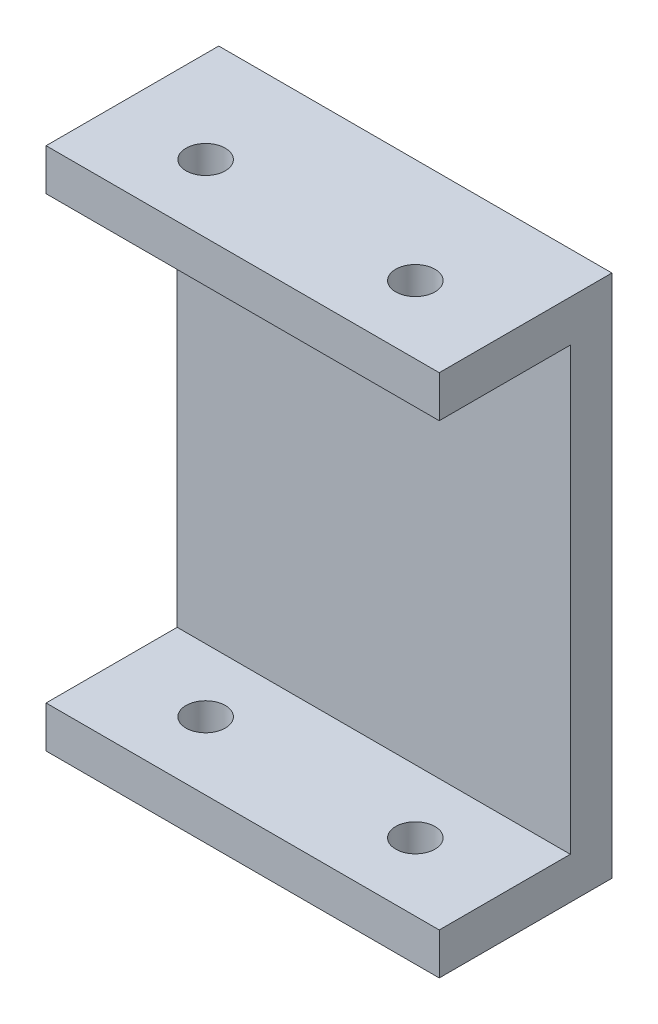
ISO-10303-21;
HEADER;
FILE_DESCRIPTION(('STEP AP214'),'2;1');
FILE_NAME('part.step','',(''),(''),'','','');
FILE_SCHEMA(('AUTOMOTIVE_DESIGN { 1 0 10303 214 1 1 1 1 }'));
ENDSEC;
DATA;
#1=APPLICATION_CONTEXT('core data for automotive mechanical design processes');
#2=APPLICATION_PROTOCOL_DEFINITION('international standard','automotive_design',2000,#1);
#3=PRODUCT_CONTEXT('',#1,'mechanical');
#4=PRODUCT('Part','Part','',(#3));
#5=PRODUCT_RELATED_PRODUCT_CATEGORY('part','',(#4));
#6=PRODUCT_DEFINITION_FORMATION('','',#4);
#7=PRODUCT_DEFINITION_CONTEXT('part definition',#1,'design');
#8=PRODUCT_DEFINITION('design','',#6,#7);
#9=PRODUCT_DEFINITION_SHAPE('','',#8);
#10=(LENGTH_UNIT() NAMED_UNIT(*) SI_UNIT(.MILLI.,.METRE.));
#11=(NAMED_UNIT(*) PLANE_ANGLE_UNIT() SI_UNIT($,.RADIAN.));
#12=(NAMED_UNIT(*) SI_UNIT($,.STERADIAN.) SOLID_ANGLE_UNIT());
#13=UNCERTAINTY_MEASURE_WITH_UNIT(LENGTH_MEASURE(1.E-05),#10,'distance_accuracy_value','');
#14=(GEOMETRIC_REPRESENTATION_CONTEXT(3) GLOBAL_UNCERTAINTY_ASSIGNED_CONTEXT((#13)) GLOBAL_UNIT_ASSIGNED_CONTEXT((#10,
#11,#12)) REPRESENTATION_CONTEXT('',''));
#15=CARTESIAN_POINT('',(0.,0.,0.));
#16=DIRECTION('',(0.,0.,1.));
#17=DIRECTION('',(1.,0.,0.));
#18=AXIS2_PLACEMENT_3D('',#15,#16,#17);
#19=CARTESIAN_POINT('',(0.,0.,3.175));
#20=DIRECTION('',(0.,0.,-1.));
#21=DIRECTION('',(-1.,0.,0.));
#22=AXIS2_PLACEMENT_3D('',#19,#20,#21);
#23=PLANE('',#22);
#24=DIRECTION('',(-1.,0.,0.));
#25=VECTOR('',#24,1.);
#26=CARTESIAN_POINT('',(15.,-16.825,3.175));
#27=LINE('',#26,#25);
#28=CARTESIAN_POINT('',(15.,-16.825,3.175));
#29=VERTEX_POINT('',#28);
#30=CARTESIAN_POINT('',(-15.,-16.825,3.175));
#31=VERTEX_POINT('',#30);
#32=EDGE_CURVE('E50',#29,#31,#27,.T.);
#33=ORIENTED_EDGE('',*,*,#32,.F.);
#34=DIRECTION('',(0.,1.,0.));
#35=VECTOR('',#34,1.);
#36=CARTESIAN_POINT('',(15.,-20.,3.175));
#37=LINE('',#36,#35);
#38=CARTESIAN_POINT('',(15.,16.825,3.175));
#39=VERTEX_POINT('',#38);
#40=EDGE_CURVE('E121',#29,#39,#37,.T.);
#41=ORIENTED_EDGE('',*,*,#40,.T.);
#42=DIRECTION('',(1.,0.,0.));
#43=VECTOR('',#42,1.);
#44=CARTESIAN_POINT('',(-15.,16.825,3.175));
#45=LINE('',#44,#43);
#46=CARTESIAN_POINT('',(-15.,16.825,3.175));
#47=VERTEX_POINT('',#46);
#48=EDGE_CURVE('E122',#47,#39,#45,.T.);
#49=ORIENTED_EDGE('',*,*,#48,.F.);
#50=DIRECTION('',(0.,-1.,0.));
#51=VECTOR('',#50,1.);
#52=CARTESIAN_POINT('',(-15.,-20.,3.175));
#53=LINE('',#52,#51);
#54=EDGE_CURVE('E55',#47,#31,#53,.T.);
#55=ORIENTED_EDGE('',*,*,#54,.T.);
#56=EDGE_LOOP('',(#33,#41,#49,#55));
#57=FACE_BOUND('',#56,.T.);
#58=ADVANCED_FACE('F33',(#57),#23,.F.);
#59=CARTESIAN_POINT('',(15.,-20.,3.175));
#60=DIRECTION('',(-1.,0.,0.));
#61=DIRECTION('',(0.,0.,1.));
#62=AXIS2_PLACEMENT_3D('',#59,#60,#61);
#63=PLANE('',#62);
#64=DIRECTION('',(0.,1.,0.));
#65=VECTOR('',#64,1.);
#66=CARTESIAN_POINT('',(15.,-20.,0.));
#67=LINE('',#66,#65);
#68=CARTESIAN_POINT('',(15.,-20.,0.));
#69=VERTEX_POINT('',#68);
#70=CARTESIAN_POINT('',(15.,20.,0.));
#71=VERTEX_POINT('',#70);
#72=EDGE_CURVE('E145',#69,#71,#67,.T.);
#73=ORIENTED_EDGE('',*,*,#72,.T.);
#74=DIRECTION('',(0.,0.,-1.));
#75=VECTOR('',#74,1.);
#76=CARTESIAN_POINT('',(15.,20.,3.175));
#77=LINE('',#76,#75);
#78=CARTESIAN_POINT('',(15.,20.,13.175));
#79=VERTEX_POINT('',#78);
#80=EDGE_CURVE('E11',#79,#71,#77,.T.);
#81=ORIENTED_EDGE('',*,*,#80,.F.);
#82=DIRECTION('',(0.,1.,0.));
#83=VECTOR('',#82,1.);
#84=CARTESIAN_POINT('',(15.,20.,13.175));
#85=LINE('',#84,#83);
#86=CARTESIAN_POINT('',(15.,16.825,13.175));
#87=VERTEX_POINT('',#86);
#88=EDGE_CURVE('E134',#87,#79,#85,.T.);
#89=ORIENTED_EDGE('',*,*,#88,.F.);
#90=DIRECTION('',(0.,0.,-1.));
#91=VECTOR('',#90,1.);
#92=CARTESIAN_POINT('',(15.,16.825,13.175));
#93=LINE('',#92,#91);
#94=EDGE_CURVE('E139',#87,#39,#93,.T.);
#95=ORIENTED_EDGE('',*,*,#94,.T.);
#96=ORIENTED_EDGE('',*,*,#40,.F.);
#97=DIRECTION('',(0.,0.,-1.));
#98=VECTOR('',#97,1.);
#99=CARTESIAN_POINT('',(15.,-16.825,13.175));
#100=LINE('',#99,#98);
#101=CARTESIAN_POINT('',(15.,-16.825,13.175));
#102=VERTEX_POINT('',#101);
#103=EDGE_CURVE('E102',#102,#29,#100,.T.);
#104=ORIENTED_EDGE('',*,*,#103,.F.);
#105=DIRECTION('',(0.,1.,0.));
#106=VECTOR('',#105,1.);
#107=CARTESIAN_POINT('',(15.,-20.,13.175));
#108=LINE('',#107,#106);
#109=CARTESIAN_POINT('',(15.,-20.,13.175));
#110=VERTEX_POINT('',#109);
#111=EDGE_CURVE('E109',#110,#102,#108,.T.);
#112=ORIENTED_EDGE('',*,*,#111,.F.);
#113=DIRECTION('',(0.,0.,-1.));
#114=VECTOR('',#113,1.);
#115=CARTESIAN_POINT('',(15.,-20.,3.175));
#116=LINE('',#115,#114);
#117=EDGE_CURVE('E149',#110,#69,#116,.T.);
#118=ORIENTED_EDGE('',*,*,#117,.T.);
#119=EDGE_LOOP('',(#73,#81,#89,#95,#96,#104,#112,#118));
#120=FACE_BOUND('',#119,.T.);
#121=ADVANCED_FACE('F35',(#120),#63,.F.);
#122=CARTESIAN_POINT('',(-15.,20.,3.175));
#123=DIRECTION('',(0.,-1.,0.));
#124=DIRECTION('',(0.,0.,-1.));
#125=AXIS2_PLACEMENT_3D('',#122,#123,#124);
#126=PLANE('',#125);
#127=CARTESIAN_POINT('',(-8.,20.,8.));
#128=DIRECTION('',(0.,-1.,0.));
#129=DIRECTION('',(0.,0.,-1.));
#130=AXIS2_PLACEMENT_3D('',#127,#128,#129);
#131=CIRCLE('',#130,1.5);
#132=CARTESIAN_POINT('',(-8.,20.,6.5));
#133=VERTEX_POINT('',#132);
#134=EDGE_CURVE('E183',#133,#133,#131,.T.);
#135=ORIENTED_EDGE('',*,*,#134,.T.);
#136=EDGE_LOOP('',(#135));
#137=FACE_BOUND('',#136,.T.);
#138=CARTESIAN_POINT('',(8.,20.,8.));
#139=DIRECTION('',(0.,-1.,0.));
#140=DIRECTION('',(0.,0.,-1.));
#141=AXIS2_PLACEMENT_3D('',#138,#139,#140);
#142=CIRCLE('',#141,1.5);
#143=CARTESIAN_POINT('',(8.,20.,6.5));
#144=VERTEX_POINT('',#143);
#145=EDGE_CURVE('E168',#144,#144,#142,.T.);
#146=ORIENTED_EDGE('',*,*,#145,.T.);
#147=EDGE_LOOP('',(#146));
#148=FACE_BOUND('',#147,.T.);
#149=DIRECTION('',(-1.,0.,0.));
#150=VECTOR('',#149,1.);
#151=CARTESIAN_POINT('',(-15.,20.,0.));
#152=LINE('',#151,#150);
#153=CARTESIAN_POINT('',(-15.,20.,0.));
#154=VERTEX_POINT('',#153);
#155=EDGE_CURVE('E151',#71,#154,#152,.T.);
#156=ORIENTED_EDGE('',*,*,#155,.T.);
#157=DIRECTION('',(0.,0.,-1.));
#158=VECTOR('',#157,1.);
#159=CARTESIAN_POINT('',(-15.,20.,3.175));
#160=LINE('',#159,#158);
#161=CARTESIAN_POINT('',(-15.,20.,13.175));
#162=VERTEX_POINT('',#161);
#163=EDGE_CURVE('E42',#162,#154,#160,.T.);
#164=ORIENTED_EDGE('',*,*,#163,.F.);
#165=DIRECTION('',(-1.,0.,0.));
#166=VECTOR('',#165,1.);
#167=CARTESIAN_POINT('',(-15.,20.,13.175));
#168=LINE('',#167,#166);
#169=EDGE_CURVE('E137',#79,#162,#168,.T.);
#170=ORIENTED_EDGE('',*,*,#169,.F.);
#171=ORIENTED_EDGE('',*,*,#80,.T.);
#172=EDGE_LOOP('',(#156,#164,#170,#171));
#173=FACE_BOUND('',#172,.T.);
#174=ADVANCED_FACE('F199',(#137,#148,#173),#126,.F.);
#175=CARTESIAN_POINT('',(-15.,-20.,3.175));
#176=DIRECTION('',(1.,0.,0.));
#177=DIRECTION('',(0.,0.,-1.));
#178=AXIS2_PLACEMENT_3D('',#175,#176,#177);
#179=PLANE('',#178);
#180=DIRECTION('',(0.,-1.,0.));
#181=VECTOR('',#180,1.);
#182=CARTESIAN_POINT('',(-15.,-20.,0.));
#183=LINE('',#182,#181);
#184=CARTESIAN_POINT('',(-15.,-20.,0.));
#185=VERTEX_POINT('',#184);
#186=EDGE_CURVE('E153',#154,#185,#183,.T.);
#187=ORIENTED_EDGE('',*,*,#186,.T.);
#188=DIRECTION('',(0.,0.,-1.));
#189=VECTOR('',#188,1.);
#190=CARTESIAN_POINT('',(-15.,-20.,3.175));
#191=LINE('',#190,#189);
#192=CARTESIAN_POINT('',(-15.,-20.,13.175));
#193=VERTEX_POINT('',#192);
#194=EDGE_CURVE('E157',#193,#185,#191,.T.);
#195=ORIENTED_EDGE('',*,*,#194,.F.);
#196=DIRECTION('',(0.,-1.,0.));
#197=VECTOR('',#196,1.);
#198=CARTESIAN_POINT('',(-15.,-20.,13.175));
#199=LINE('',#198,#197);
#200=CARTESIAN_POINT('',(-15.,-16.825,13.175));
#201=VERTEX_POINT('',#200);
#202=EDGE_CURVE('E108',#201,#193,#199,.T.);
#203=ORIENTED_EDGE('',*,*,#202,.F.);
#204=DIRECTION('',(0.,0.,-1.));
#205=VECTOR('',#204,1.);
#206=CARTESIAN_POINT('',(-15.,-16.825,13.175));
#207=LINE('',#206,#205);
#208=EDGE_CURVE('E104',#201,#31,#207,.T.);
#209=ORIENTED_EDGE('',*,*,#208,.T.);
#210=ORIENTED_EDGE('',*,*,#54,.F.);
#211=DIRECTION('',(0.,0.,-1.));
#212=VECTOR('',#211,1.);
#213=CARTESIAN_POINT('',(-15.,16.825,13.175));
#214=LINE('',#213,#212);
#215=CARTESIAN_POINT('',(-15.,16.825,13.175));
#216=VERTEX_POINT('',#215);
#217=EDGE_CURVE('E142',#216,#47,#214,.T.);
#218=ORIENTED_EDGE('',*,*,#217,.F.);
#219=DIRECTION('',(0.,-1.,0.));
#220=VECTOR('',#219,1.);
#221=CARTESIAN_POINT('',(-15.,20.,13.175));
#222=LINE('',#221,#220);
#223=EDGE_CURVE('E125',#162,#216,#222,.T.);
#224=ORIENTED_EDGE('',*,*,#223,.F.);
#225=ORIENTED_EDGE('',*,*,#163,.T.);
#226=EDGE_LOOP('',(#187,#195,#203,#209,#210,#218,#224,#225));
#227=FACE_BOUND('',#226,.T.);
#228=ADVANCED_FACE('F188',(#227),#179,.F.);
#229=CARTESIAN_POINT('',(-15.,-20.,3.175));
#230=DIRECTION('',(0.,1.,0.));
#231=DIRECTION('',(0.,0.,1.));
#232=AXIS2_PLACEMENT_3D('',#229,#230,#231);
#233=PLANE('',#232);
#234=CARTESIAN_POINT('',(-8.,-20.,8.));
#235=DIRECTION('',(0.,1.,0.));
#236=DIRECTION('',(0.,0.,1.));
#237=AXIS2_PLACEMENT_3D('',#234,#235,#236);
#238=CIRCLE('',#237,1.5);
#239=CARTESIAN_POINT('',(-8.,-20.,9.5));
#240=VERTEX_POINT('',#239);
#241=EDGE_CURVE('E164',#240,#240,#238,.T.);
#242=ORIENTED_EDGE('',*,*,#241,.T.);
#243=EDGE_LOOP('',(#242));
#244=FACE_BOUND('',#243,.T.);
#245=CARTESIAN_POINT('',(8.,-20.,8.));
#246=DIRECTION('',(0.,1.,0.));
#247=DIRECTION('',(0.,0.,1.));
#248=AXIS2_PLACEMENT_3D('',#245,#246,#247);
#249=CIRCLE('',#248,1.5);
#250=CARTESIAN_POINT('',(8.,-20.,9.5));
#251=VERTEX_POINT('',#250);
#252=EDGE_CURVE('E171',#251,#251,#249,.T.);
#253=ORIENTED_EDGE('',*,*,#252,.T.);
#254=EDGE_LOOP('',(#253));
#255=FACE_BOUND('',#254,.T.);
#256=DIRECTION('',(1.,0.,0.));
#257=VECTOR('',#256,1.);
#258=CARTESIAN_POINT('',(-15.,-20.,0.));
#259=LINE('',#258,#257);
#260=EDGE_CURVE('E147',#185,#69,#259,.T.);
#261=ORIENTED_EDGE('',*,*,#260,.T.);
#262=ORIENTED_EDGE('',*,*,#117,.F.);
#263=DIRECTION('',(1.,0.,0.));
#264=VECTOR('',#263,1.);
#265=CARTESIAN_POINT('',(15.,-20.,13.175));
#266=LINE('',#265,#264);
#267=EDGE_CURVE('E115',#193,#110,#266,.T.);
#268=ORIENTED_EDGE('',*,*,#267,.F.);
#269=ORIENTED_EDGE('',*,*,#194,.T.);
#270=EDGE_LOOP('',(#261,#262,#268,#269));
#271=FACE_BOUND('',#270,.T.);
#272=ADVANCED_FACE('F191',(#244,#255,#271),#233,.F.);
#273=CARTESIAN_POINT('',(0.,0.,0.));
#274=DIRECTION('',(0.,0.,-1.));
#275=DIRECTION('',(-1.,0.,0.));
#276=AXIS2_PLACEMENT_3D('',#273,#274,#275);
#277=PLANE('',#276);
#278=ORIENTED_EDGE('',*,*,#72,.F.);
#279=ORIENTED_EDGE('',*,*,#260,.F.);
#280=ORIENTED_EDGE('',*,*,#186,.F.);
#281=ORIENTED_EDGE('',*,*,#155,.F.);
#282=EDGE_LOOP('',(#278,#279,#280,#281));
#283=FACE_BOUND('',#282,.T.);
#284=ADVANCED_FACE('F195',(#283),#277,.T.);
#285=CARTESIAN_POINT('',(-15.,16.825,13.175));
#286=DIRECTION('',(0.,1.,0.));
#287=DIRECTION('',(-1.,0.,0.));
#288=AXIS2_PLACEMENT_3D('',#285,#286,#287);
#289=PLANE('',#288);
#290=CARTESIAN_POINT('',(-8.,16.825,8.));
#291=DIRECTION('',(0.,1.,0.));
#292=DIRECTION('',(-1.,0.,0.));
#293=AXIS2_PLACEMENT_3D('',#290,#291,#292);
#294=CIRCLE('',#293,1.5);
#295=CARTESIAN_POINT('',(-9.5,16.825,8.));
#296=VERTEX_POINT('',#295);
#297=EDGE_CURVE('E180',#296,#296,#294,.T.);
#298=ORIENTED_EDGE('',*,*,#297,.T.);
#299=EDGE_LOOP('',(#298));
#300=FACE_BOUND('',#299,.T.);
#301=CARTESIAN_POINT('',(8.,16.825,8.));
#302=DIRECTION('',(0.,1.,0.));
#303=DIRECTION('',(-1.,0.,0.));
#304=AXIS2_PLACEMENT_3D('',#301,#302,#303);
#305=CIRCLE('',#304,1.5);
#306=CARTESIAN_POINT('',(6.5,16.825,8.));
#307=VERTEX_POINT('',#306);
#308=EDGE_CURVE('E163',#307,#307,#305,.T.);
#309=ORIENTED_EDGE('',*,*,#308,.T.);
#310=EDGE_LOOP('',(#309));
#311=FACE_BOUND('',#310,.T.);
#312=ORIENTED_EDGE('',*,*,#48,.T.);
#313=ORIENTED_EDGE('',*,*,#94,.F.);
#314=DIRECTION('',(1.,0.,0.));
#315=VECTOR('',#314,1.);
#316=CARTESIAN_POINT('',(-15.,16.825,13.175));
#317=LINE('',#316,#315);
#318=EDGE_CURVE('E132',#216,#87,#317,.T.);
#319=ORIENTED_EDGE('',*,*,#318,.F.);
#320=ORIENTED_EDGE('',*,*,#217,.T.);
#321=EDGE_LOOP('',(#312,#313,#319,#320));
#322=FACE_BOUND('',#321,.T.);
#323=ADVANCED_FACE('F206',(#300,#311,#322),#289,.F.);
#324=CARTESIAN_POINT('',(0.,0.,13.175));
#325=DIRECTION('',(0.,0.,1.));
#326=DIRECTION('',(1.,0.,0.));
#327=AXIS2_PLACEMENT_3D('',#324,#325,#326);
#328=PLANE('',#327);
#329=ORIENTED_EDGE('',*,*,#223,.T.);
#330=ORIENTED_EDGE('',*,*,#318,.T.);
#331=ORIENTED_EDGE('',*,*,#88,.T.);
#332=ORIENTED_EDGE('',*,*,#169,.T.);
#333=EDGE_LOOP('',(#329,#330,#331,#332));
#334=FACE_BOUND('',#333,.T.);
#335=ADVANCED_FACE('F202',(#334),#328,.T.);
#336=CARTESIAN_POINT('',(15.,-16.825,13.175));
#337=DIRECTION('',(0.,-1.,0.));
#338=DIRECTION('',(1.,0.,0.));
#339=AXIS2_PLACEMENT_3D('',#336,#337,#338);
#340=PLANE('',#339);
#341=CARTESIAN_POINT('',(-8.,-16.825,8.));
#342=DIRECTION('',(0.,-1.,0.));
#343=DIRECTION('',(1.,0.,0.));
#344=AXIS2_PLACEMENT_3D('',#341,#342,#343);
#345=CIRCLE('',#344,1.5);
#346=CARTESIAN_POINT('',(-6.5,-16.825,8.));
#347=VERTEX_POINT('',#346);
#348=EDGE_CURVE('E37',#347,#347,#345,.T.);
#349=ORIENTED_EDGE('',*,*,#348,.T.);
#350=EDGE_LOOP('',(#349));
#351=FACE_BOUND('',#350,.T.);
#352=CARTESIAN_POINT('',(8.,-16.825,8.));
#353=DIRECTION('',(0.,-1.,0.));
#354=DIRECTION('',(1.,0.,0.));
#355=AXIS2_PLACEMENT_3D('',#352,#353,#354);
#356=CIRCLE('',#355,1.5);
#357=CARTESIAN_POINT('',(9.5,-16.825,8.));
#358=VERTEX_POINT('',#357);
#359=EDGE_CURVE('E161',#358,#358,#356,.T.);
#360=ORIENTED_EDGE('',*,*,#359,.T.);
#361=EDGE_LOOP('',(#360));
#362=FACE_BOUND('',#361,.T.);
#363=ORIENTED_EDGE('',*,*,#32,.T.);
#364=ORIENTED_EDGE('',*,*,#208,.F.);
#365=DIRECTION('',(-1.,0.,0.));
#366=VECTOR('',#365,1.);
#367=CARTESIAN_POINT('',(15.,-16.825,13.175));
#368=LINE('',#367,#366);
#369=EDGE_CURVE('E98',#102,#201,#368,.T.);
#370=ORIENTED_EDGE('',*,*,#369,.F.);
#371=ORIENTED_EDGE('',*,*,#103,.T.);
#372=EDGE_LOOP('',(#363,#364,#370,#371));
#373=FACE_BOUND('',#372,.T.);
#374=ADVANCED_FACE('F100',(#351,#362,#373),#340,.F.);
#375=CARTESIAN_POINT('',(0.,0.,13.175));
#376=DIRECTION('',(0.,0.,1.));
#377=DIRECTION('',(1.,0.,0.));
#378=AXIS2_PLACEMENT_3D('',#375,#376,#377);
#379=PLANE('',#378);
#380=ORIENTED_EDGE('',*,*,#111,.T.);
#381=ORIENTED_EDGE('',*,*,#369,.T.);
#382=ORIENTED_EDGE('',*,*,#202,.T.);
#383=ORIENTED_EDGE('',*,*,#267,.T.);
#384=EDGE_LOOP('',(#380,#381,#382,#383));
#385=FACE_BOUND('',#384,.T.);
#386=ADVANCED_FACE('F113',(#385),#379,.T.);
#387=CARTESIAN_POINT('',(8.,-20.,8.));
#388=DIRECTION('',(0.,1.,0.));
#389=DIRECTION('',(0.,0.,1.));
#390=AXIS2_PLACEMENT_3D('',#387,#388,#389);
#391=CYLINDRICAL_SURFACE('',#390,1.5);
#392=ORIENTED_EDGE('',*,*,#252,.F.);
#393=EDGE_LOOP('',(#392));
#394=FACE_BOUND('',#393,.T.);
#395=ORIENTED_EDGE('',*,*,#359,.F.);
#396=EDGE_LOOP('',(#395));
#397=FACE_BOUND('',#396,.T.);
#398=ADVANCED_FACE('F234',(#394,#397),#391,.F.);
#399=CARTESIAN_POINT('',(-8.,-20.,8.));
#400=DIRECTION('',(0.,1.,0.));
#401=DIRECTION('',(0.,0.,1.));
#402=AXIS2_PLACEMENT_3D('',#399,#400,#401);
#403=CYLINDRICAL_SURFACE('',#402,1.5);
#404=ORIENTED_EDGE('',*,*,#241,.F.);
#405=EDGE_LOOP('',(#404));
#406=FACE_BOUND('',#405,.T.);
#407=ORIENTED_EDGE('',*,*,#348,.F.);
#408=EDGE_LOOP('',(#407));
#409=FACE_BOUND('',#408,.T.);
#410=ADVANCED_FACE('F231',(#406,#409),#403,.F.);
#411=ORIENTED_EDGE('',*,*,#308,.F.);
#412=EDGE_LOOP('',(#411));
#413=FACE_BOUND('',#412,.T.);
#414=ORIENTED_EDGE('',*,*,#145,.F.);
#415=EDGE_LOOP('',(#414));
#416=FACE_BOUND('',#415,.T.);
#417=ADVANCED_FACE('F228',(#413,#416),#391,.F.);
#418=ORIENTED_EDGE('',*,*,#297,.F.);
#419=EDGE_LOOP('',(#418));
#420=FACE_BOUND('',#419,.T.);
#421=ORIENTED_EDGE('',*,*,#134,.F.);
#422=EDGE_LOOP('',(#421));
#423=FACE_BOUND('',#422,.T.);
#424=ADVANCED_FACE('F230',(#420,#423),#403,.F.);
#425=CLOSED_SHELL('',(#58,#121,#174,#228,#272,#284,#323,#335,#374,#386,#398,#410,#417,#424));
#426=MANIFOLD_SOLID_BREP('B2',#425);
#427=ADVANCED_BREP_SHAPE_REPRESENTATION('',(#18,#426),#14);
#428=SHAPE_DEFINITION_REPRESENTATION(#9,#427);
ENDSEC;
END-ISO-10303-21;
